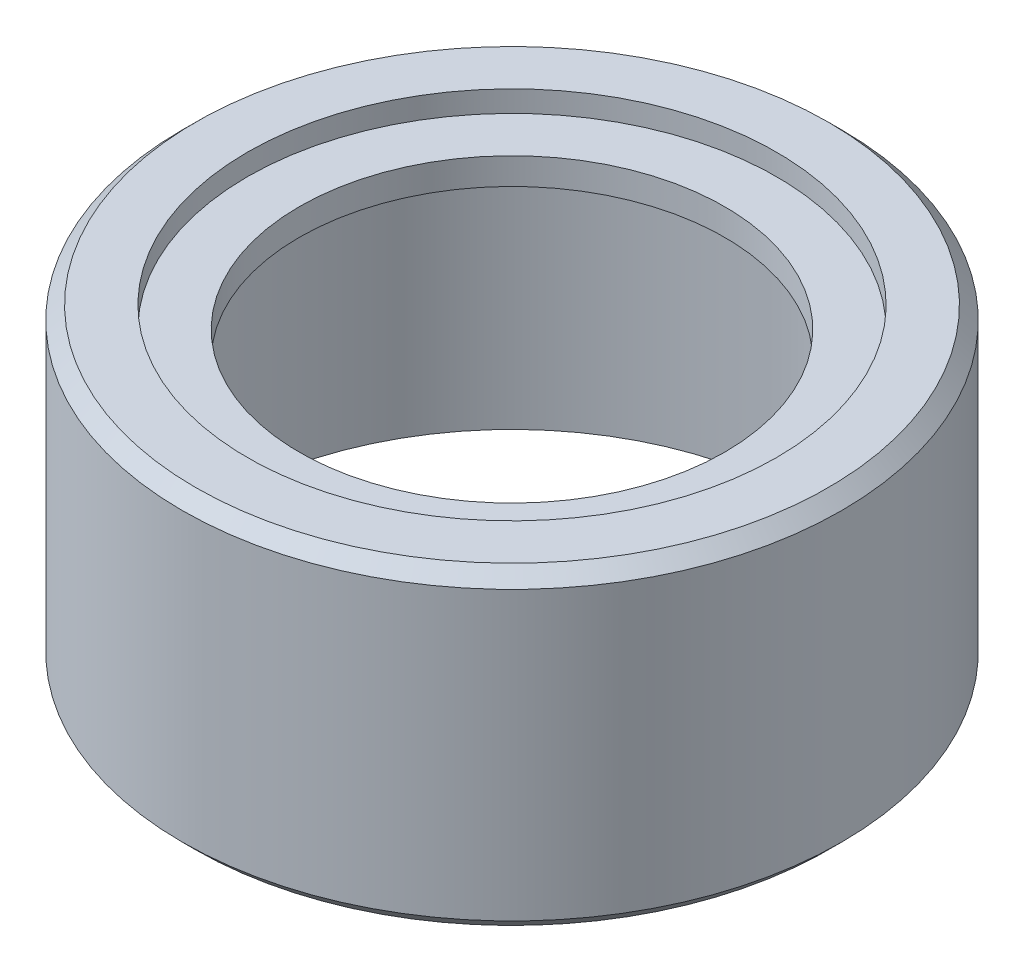
ISO-10303-21;
HEADER;
FILE_DESCRIPTION(('STEP AP214'),'2;1');
FILE_NAME('part.step','',(''),(''),'','','');
FILE_SCHEMA(('AUTOMOTIVE_DESIGN { 1 0 10303 214 1 1 1 1 }'));
ENDSEC;
DATA;
#1=APPLICATION_CONTEXT('core data for automotive mechanical design processes');
#2=APPLICATION_PROTOCOL_DEFINITION('international standard','automotive_design',2000,#1);
#3=PRODUCT_CONTEXT('',#1,'mechanical');
#4=PRODUCT('Part','Part','',(#3));
#5=PRODUCT_RELATED_PRODUCT_CATEGORY('part','',(#4));
#6=PRODUCT_DEFINITION_FORMATION('','',#4);
#7=PRODUCT_DEFINITION_CONTEXT('part definition',#1,'design');
#8=PRODUCT_DEFINITION('design','',#6,#7);
#9=PRODUCT_DEFINITION_SHAPE('','',#8);
#10=(LENGTH_UNIT() NAMED_UNIT(*) SI_UNIT(.MILLI.,.METRE.));
#11=(NAMED_UNIT(*) PLANE_ANGLE_UNIT() SI_UNIT($,.RADIAN.));
#12=(NAMED_UNIT(*) SI_UNIT($,.STERADIAN.) SOLID_ANGLE_UNIT());
#13=UNCERTAINTY_MEASURE_WITH_UNIT(LENGTH_MEASURE(1.E-05),#10,'distance_accuracy_value','');
#14=(GEOMETRIC_REPRESENTATION_CONTEXT(3) GLOBAL_UNCERTAINTY_ASSIGNED_CONTEXT((#13)) GLOBAL_UNIT_ASSIGNED_CONTEXT((#10,
#11,#12)) REPRESENTATION_CONTEXT('',''));
#15=CARTESIAN_POINT('',(0.,0.,0.));
#16=DIRECTION('',(0.,0.,1.));
#17=DIRECTION('',(1.,0.,0.));
#18=AXIS2_PLACEMENT_3D('',#15,#16,#17);
#19=CARTESIAN_POINT('',(0.,0.2499999999787,0.));
#20=DIRECTION('',(0.,1.,0.));
#21=DIRECTION('',(0.,0.,-1.));
#22=AXIS2_PLACEMENT_3D('',#19,#20,#21);
#23=CONICAL_SURFACE('',#22,12.14999999998,0.785398163397448);
#24=CARTESIAN_POINT('',(0.,0.5,0.));
#25=DIRECTION('',(0.,1.,0.));
#26=DIRECTION('',(-1.,0.,0.));
#27=AXIS2_PLACEMENT_3D('',#24,#25,#26);
#28=CIRCLE('',#27,12.4);
#29=CARTESIAN_POINT('',(0.,0.499999999999366,12.4000000000006));
#30=VERTEX_POINT('',#29);
#31=CARTESIAN_POINT('',(-12.4,0.5,0.));
#32=VERTEX_POINT('',#31);
#33=EDGE_CURVE('E27',#30,#32,#28,.T.);
#34=ORIENTED_EDGE('',*,*,#33,.F.);
#35=DIRECTION('',(0.,-0.707106781186548,-0.707106781186548));
#36=VECTOR('',#35,1.);
#37=CARTESIAN_POINT('',(0.,0.2499999999787,12.14999999998));
#38=LINE('',#37,#36);
#39=CARTESIAN_POINT('',(0.,-6.50417220082744E-13,11.9000000000006));
#40=VERTEX_POINT('',#39);
#41=EDGE_CURVE('E11',#30,#40,#38,.T.);
#42=ORIENTED_EDGE('',*,*,#41,.T.);
#43=CARTESIAN_POINT('',(0.,0.,0.));
#44=DIRECTION('',(0.,1.,0.));
#45=DIRECTION('',(1.,0.,0.));
#46=AXIS2_PLACEMENT_3D('',#43,#44,#45);
#47=CIRCLE('',#46,11.9);
#48=EDGE_CURVE('E102',#40,#40,#47,.T.);
#49=ORIENTED_EDGE('',*,*,#48,.T.);
#50=ORIENTED_EDGE('',*,*,#41,.F.);
#51=CARTESIAN_POINT('',(0.,0.5,0.));
#52=DIRECTION('',(0.,1.,0.));
#53=DIRECTION('',(-1.,0.,0.));
#54=AXIS2_PLACEMENT_3D('',#51,#52,#53);
#55=CIRCLE('',#54,12.4);
#56=EDGE_CURVE('E104',#32,#30,#55,.T.);
#57=ORIENTED_EDGE('',*,*,#56,.F.);
#58=EDGE_LOOP('',(#34,#42,#49,#50,#57));
#59=FACE_BOUND('',#58,.T.);
#60=ADVANCED_FACE('F17',(#59),#23,.T.);
#61=CARTESIAN_POINT('',(0.,-0.59,0.));
#62=DIRECTION('',(0.,1.,0.));
#63=DIRECTION('',(1.,0.,0.));
#64=AXIS2_PLACEMENT_3D('',#61,#62,#63);
#65=CYLINDRICAL_SURFACE('',#64,12.4);
#66=CARTESIAN_POINT('',(0.,11.3,0.));
#67=DIRECTION('',(0.,1.,0.));
#68=DIRECTION('',(1.,0.,0.));
#69=AXIS2_PLACEMENT_3D('',#66,#67,#68);
#70=CIRCLE('',#69,12.4);
#71=CARTESIAN_POINT('',(-12.4,11.3,0.));
#72=VERTEX_POINT('',#71);
#73=CARTESIAN_POINT('',(0.,11.3,12.4));
#74=VERTEX_POINT('',#73);
#75=EDGE_CURVE('E124',#72,#74,#70,.T.);
#76=ORIENTED_EDGE('',*,*,#75,.F.);
#77=DIRECTION('',(0.,-1.,0.));
#78=VECTOR('',#77,1.);
#79=CARTESIAN_POINT('',(-12.4,-0.59,0.));
#80=LINE('',#79,#78);
#81=EDGE_CURVE('E68',#72,#32,#80,.T.);
#82=ORIENTED_EDGE('',*,*,#81,.T.);
#83=ORIENTED_EDGE('',*,*,#56,.T.);
#84=ORIENTED_EDGE('',*,*,#33,.T.);
#85=ORIENTED_EDGE('',*,*,#81,.F.);
#86=CARTESIAN_POINT('',(0.,11.3,0.));
#87=DIRECTION('',(0.,1.,0.));
#88=DIRECTION('',(1.,0.,0.));
#89=AXIS2_PLACEMENT_3D('',#86,#87,#88);
#90=CIRCLE('',#89,12.4);
#91=EDGE_CURVE('E115',#74,#72,#90,.T.);
#92=ORIENTED_EDGE('',*,*,#91,.F.);
#93=EDGE_LOOP('',(#76,#82,#83,#84,#85,#92));
#94=FACE_BOUND('',#93,.T.);
#95=ADVANCED_FACE('F108',(#94),#65,.T.);
#96=CARTESIAN_POINT('',(0.,11.55000000004,0.));
#97=DIRECTION('',(0.,-1.,0.));
#98=DIRECTION('',(0.,0.,-1.));
#99=AXIS2_PLACEMENT_3D('',#96,#97,#98);
#100=CONICAL_SURFACE('',#99,12.14999999996,0.785398163397448);
#101=ORIENTED_EDGE('',*,*,#75,.T.);
#102=DIRECTION('',(0.,0.707106781186548,-0.707106781186548));
#103=VECTOR('',#102,1.);
#104=CARTESIAN_POINT('',(0.,11.55000000004,12.14999999996));
#105=LINE('',#104,#103);
#106=CARTESIAN_POINT('',(0.,11.8,11.9));
#107=VERTEX_POINT('',#106);
#108=EDGE_CURVE('E81',#74,#107,#105,.T.);
#109=ORIENTED_EDGE('',*,*,#108,.T.);
#110=CARTESIAN_POINT('',(0.,11.8,0.));
#111=DIRECTION('',(0.,1.,0.));
#112=DIRECTION('',(1.,0.,0.));
#113=AXIS2_PLACEMENT_3D('',#110,#111,#112);
#114=CIRCLE('',#113,11.9);
#115=EDGE_CURVE('E121',#107,#107,#114,.T.);
#116=ORIENTED_EDGE('',*,*,#115,.F.);
#117=ORIENTED_EDGE('',*,*,#108,.F.);
#118=ORIENTED_EDGE('',*,*,#91,.T.);
#119=EDGE_LOOP('',(#101,#109,#116,#117,#118));
#120=FACE_BOUND('',#119,.T.);
#121=ADVANCED_FACE('F190',(#120),#100,.T.);
#122=CARTESIAN_POINT('',(0.,11.8,0.));
#123=DIRECTION('',(0.,1.,0.));
#124=DIRECTION('',(1.,0.,0.));
#125=AXIS2_PLACEMENT_3D('',#122,#123,#124);
#126=PLANE('',#125);
#127=CARTESIAN_POINT('',(0.,11.8,0.));
#128=DIRECTION('',(0.,1.,0.));
#129=DIRECTION('',(1.,0.,0.));
#130=AXIS2_PLACEMENT_3D('',#127,#128,#129);
#131=CIRCLE('',#130,9.95);
#132=CARTESIAN_POINT('',(-9.95,11.8,0.));
#133=VERTEX_POINT('',#132);
#134=EDGE_CURVE('E119',#133,#133,#131,.T.);
#135=ORIENTED_EDGE('',*,*,#134,.F.);
#136=EDGE_LOOP('',(#135));
#137=FACE_BOUND('',#136,.T.);
#138=ORIENTED_EDGE('',*,*,#115,.T.);
#139=EDGE_LOOP('',(#138));
#140=FACE_BOUND('',#139,.T.);
#141=ADVANCED_FACE('F181',(#137,#140),#126,.T.);
#142=CARTESIAN_POINT('',(0.,-0.59,0.));
#143=DIRECTION('',(0.,1.,0.));
#144=DIRECTION('',(1.,0.,0.));
#145=AXIS2_PLACEMENT_3D('',#142,#143,#144);
#146=CYLINDRICAL_SURFACE('',#145,9.95);
#147=CARTESIAN_POINT('',(0.,11.,0.));
#148=DIRECTION('',(0.,1.,0.));
#149=DIRECTION('',(1.,0.,0.));
#150=AXIS2_PLACEMENT_3D('',#147,#148,#149);
#151=CIRCLE('',#150,9.95);
#152=CARTESIAN_POINT('',(-9.95,11.,0.));
#153=VERTEX_POINT('',#152);
#154=EDGE_CURVE('E142',#153,#153,#151,.T.);
#155=ORIENTED_EDGE('',*,*,#154,.F.);
#156=DIRECTION('',(0.,1.,0.));
#157=VECTOR('',#156,1.);
#158=CARTESIAN_POINT('',(-9.95,-0.59,0.));
#159=LINE('',#158,#157);
#160=EDGE_CURVE('E138',#153,#133,#159,.T.);
#161=ORIENTED_EDGE('',*,*,#160,.T.);
#162=ORIENTED_EDGE('',*,*,#134,.T.);
#163=ORIENTED_EDGE('',*,*,#160,.F.);
#164=EDGE_LOOP('',(#155,#161,#162,#163));
#165=FACE_BOUND('',#164,.T.);
#166=ADVANCED_FACE('F172',(#165),#146,.F.);
#167=CARTESIAN_POINT('',(0.,11.,0.));
#168=DIRECTION('',(0.,1.,0.));
#169=DIRECTION('',(1.,0.,0.));
#170=AXIS2_PLACEMENT_3D('',#167,#168,#169);
#171=PLANE('',#170);
#172=CARTESIAN_POINT('',(0.,11.,0.));
#173=DIRECTION('',(0.,1.,0.));
#174=DIRECTION('',(1.,0.,0.));
#175=AXIS2_PLACEMENT_3D('',#172,#173,#174);
#176=CIRCLE('',#175,8.);
#177=CARTESIAN_POINT('',(-8.,11.,0.));
#178=VERTEX_POINT('',#177);
#179=EDGE_CURVE('E20',#178,#178,#176,.T.);
#180=ORIENTED_EDGE('',*,*,#179,.F.);
#181=EDGE_LOOP('',(#180));
#182=FACE_BOUND('',#181,.T.);
#183=ORIENTED_EDGE('',*,*,#154,.T.);
#184=EDGE_LOOP('',(#183));
#185=FACE_BOUND('',#184,.T.);
#186=ADVANCED_FACE('F170',(#182,#185),#171,.T.);
#187=CARTESIAN_POINT('',(0.,-0.59,0.));
#188=DIRECTION('',(0.,1.,0.));
#189=DIRECTION('',(1.,0.,0.));
#190=AXIS2_PLACEMENT_3D('',#187,#188,#189);
#191=CYLINDRICAL_SURFACE('',#190,8.);
#192=CARTESIAN_POINT('',(0.,10.,0.));
#193=DIRECTION('',(0.,1.,0.));
#194=DIRECTION('',(1.,0.,0.));
#195=AXIS2_PLACEMENT_3D('',#192,#193,#194);
#196=CIRCLE('',#195,8.);
#197=CARTESIAN_POINT('',(-8.,10.,0.));
#198=VERTEX_POINT('',#197);
#199=EDGE_CURVE('E128',#198,#198,#196,.T.);
#200=ORIENTED_EDGE('',*,*,#199,.F.);
#201=DIRECTION('',(0.,1.,0.));
#202=VECTOR('',#201,1.);
#203=CARTESIAN_POINT('',(-8.,-0.59,0.));
#204=LINE('',#203,#202);
#205=EDGE_CURVE('E132',#198,#178,#204,.T.);
#206=ORIENTED_EDGE('',*,*,#205,.T.);
#207=ORIENTED_EDGE('',*,*,#179,.T.);
#208=ORIENTED_EDGE('',*,*,#205,.F.);
#209=EDGE_LOOP('',(#200,#206,#207,#208));
#210=FACE_BOUND('',#209,.T.);
#211=ADVANCED_FACE('F168',(#210),#191,.F.);
#212=CARTESIAN_POINT('',(0.,10.,0.));
#213=DIRECTION('',(0.,1.,0.));
#214=DIRECTION('',(1.,0.,0.));
#215=AXIS2_PLACEMENT_3D('',#212,#213,#214);
#216=PLANE('',#215);
#217=ORIENTED_EDGE('',*,*,#199,.T.);
#218=EDGE_LOOP('',(#217));
#219=FACE_BOUND('',#218,.T.);
#220=CARTESIAN_POINT('',(0.,10.,0.));
#221=DIRECTION('',(0.,1.,0.));
#222=DIRECTION('',(1.,0.,0.));
#223=AXIS2_PLACEMENT_3D('',#220,#221,#222);
#224=CIRCLE('',#223,10.95);
#225=CARTESIAN_POINT('',(-10.95,10.,0.));
#226=VERTEX_POINT('',#225);
#227=EDGE_CURVE('E93',#226,#226,#224,.T.);
#228=ORIENTED_EDGE('',*,*,#227,.F.);
#229=EDGE_LOOP('',(#228));
#230=FACE_BOUND('',#229,.T.);
#231=ADVANCED_FACE('F179',(#219,#230),#216,.F.);
#232=CARTESIAN_POINT('',(0.,-0.59,0.));
#233=DIRECTION('',(0.,1.,0.));
#234=DIRECTION('',(1.,0.,0.));
#235=AXIS2_PLACEMENT_3D('',#232,#233,#234);
#236=CYLINDRICAL_SURFACE('',#235,10.95);
#237=CARTESIAN_POINT('',(0.,0.,0.));
#238=DIRECTION('',(0.,1.,0.));
#239=DIRECTION('',(1.,0.,0.));
#240=AXIS2_PLACEMENT_3D('',#237,#238,#239);
#241=CIRCLE('',#240,10.95);
#242=CARTESIAN_POINT('',(-10.95,0.,0.));
#243=VERTEX_POINT('',#242);
#244=EDGE_CURVE('E127',#243,#243,#241,.T.);
#245=ORIENTED_EDGE('',*,*,#244,.F.);
#246=DIRECTION('',(0.,1.,0.));
#247=VECTOR('',#246,1.);
#248=CARTESIAN_POINT('',(-10.95,-0.59,0.));
#249=LINE('',#248,#247);
#250=EDGE_CURVE('E98',#243,#226,#249,.T.);
#251=ORIENTED_EDGE('',*,*,#250,.T.);
#252=ORIENTED_EDGE('',*,*,#227,.T.);
#253=ORIENTED_EDGE('',*,*,#250,.F.);
#254=EDGE_LOOP('',(#245,#251,#252,#253));
#255=FACE_BOUND('',#254,.T.);
#256=ADVANCED_FACE('F240',(#255),#236,.F.);
#257=CARTESIAN_POINT('',(0.,0.,0.));
#258=DIRECTION('',(0.,1.,0.));
#259=DIRECTION('',(1.,0.,0.));
#260=AXIS2_PLACEMENT_3D('',#257,#258,#259);
#261=PLANE('',#260);
#262=ORIENTED_EDGE('',*,*,#244,.T.);
#263=EDGE_LOOP('',(#262));
#264=FACE_BOUND('',#263,.T.);
#265=ORIENTED_EDGE('',*,*,#48,.F.);
#266=EDGE_LOOP('',(#265));
#267=FACE_BOUND('',#266,.T.);
#268=ADVANCED_FACE('F236',(#264,#267),#261,.F.);
#269=CLOSED_SHELL('',(#60,#95,#121,#141,#166,#186,#211,#231,#256,#268));
#270=MANIFOLD_SOLID_BREP('B1',#269);
#271=ADVANCED_BREP_SHAPE_REPRESENTATION('',(#18,#270),#14);
#272=SHAPE_DEFINITION_REPRESENTATION(#9,#271);
ENDSEC;
END-ISO-10303-21;
